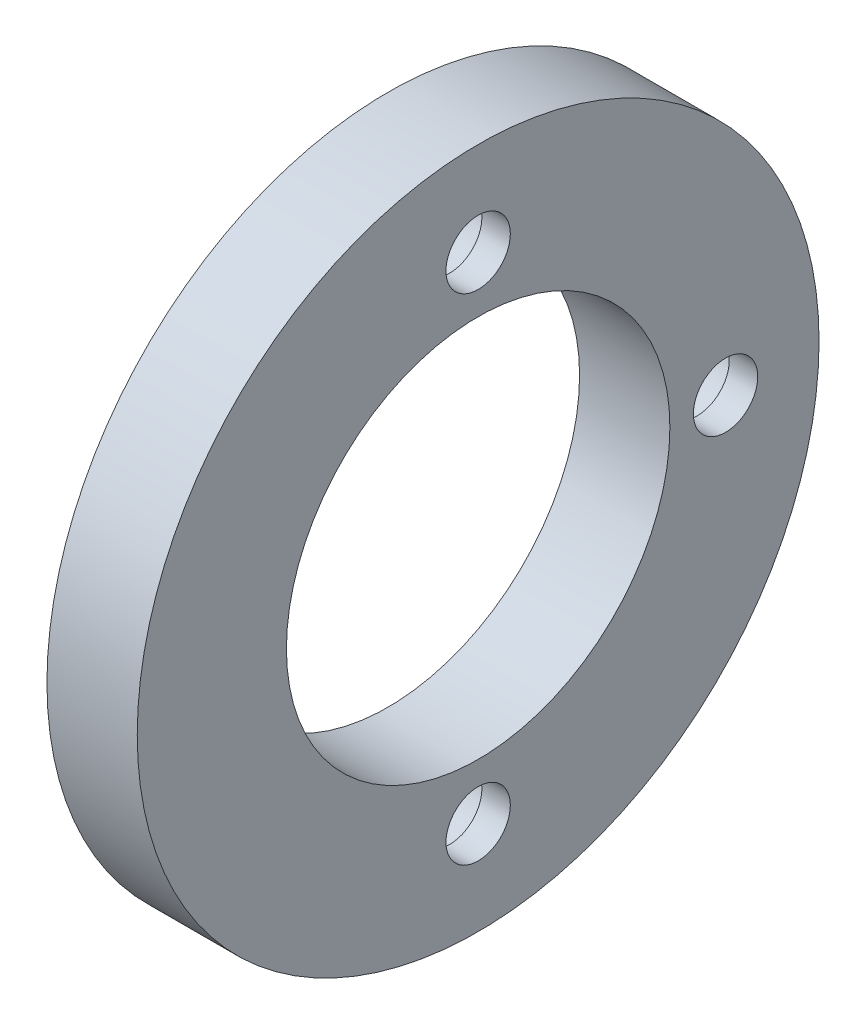
ISO-10303-21;
HEADER;
FILE_DESCRIPTION(('STEP AP214'),'2;1');
FILE_NAME('part.step','',(''),(''),'','','');
FILE_SCHEMA(('AUTOMOTIVE_DESIGN { 1 0 10303 214 1 1 1 1 }'));
ENDSEC;
DATA;
#1=APPLICATION_CONTEXT('core data for automotive mechanical design processes');
#2=APPLICATION_PROTOCOL_DEFINITION('international standard','automotive_design',2000,#1);
#3=PRODUCT_CONTEXT('',#1,'mechanical');
#4=PRODUCT('Part','Part','',(#3));
#5=PRODUCT_RELATED_PRODUCT_CATEGORY('part','',(#4));
#6=PRODUCT_DEFINITION_FORMATION('','',#4);
#7=PRODUCT_DEFINITION_CONTEXT('part definition',#1,'design');
#8=PRODUCT_DEFINITION('design','',#6,#7);
#9=PRODUCT_DEFINITION_SHAPE('','',#8);
#10=(LENGTH_UNIT() NAMED_UNIT(*) SI_UNIT(.MILLI.,.METRE.));
#11=(NAMED_UNIT(*) PLANE_ANGLE_UNIT() SI_UNIT($,.RADIAN.));
#12=(NAMED_UNIT(*) SI_UNIT($,.STERADIAN.) SOLID_ANGLE_UNIT());
#13=UNCERTAINTY_MEASURE_WITH_UNIT(LENGTH_MEASURE(1.E-05),#10,'distance_accuracy_value','');
#14=(GEOMETRIC_REPRESENTATION_CONTEXT(3) GLOBAL_UNCERTAINTY_ASSIGNED_CONTEXT((#13)) GLOBAL_UNIT_ASSIGNED_CONTEXT((#10,
#11,#12)) REPRESENTATION_CONTEXT('',''));
#15=CARTESIAN_POINT('',(0.,0.,0.));
#16=DIRECTION('',(0.,0.,1.));
#17=DIRECTION('',(1.,0.,0.));
#18=AXIS2_PLACEMENT_3D('',#15,#16,#17);
#19=CARTESIAN_POINT('',(9.271,0.,-25.4));
#20=DIRECTION('',(-1.,0.,0.));
#21=DIRECTION('',(0.,0.,1.));
#22=AXIS2_PLACEMENT_3D('',#19,#20,#21);
#23=CYLINDRICAL_SURFACE('',#22,3.302);
#24=CARTESIAN_POINT('',(9.271,0.,-25.4));
#25=DIRECTION('',(1.,0.,0.));
#26=DIRECTION('',(0.,0.,-1.));
#27=AXIS2_PLACEMENT_3D('',#24,#25,#26);
#28=CIRCLE('',#27,3.302);
#29=CARTESIAN_POINT('',(9.271,0.,-28.702));
#30=VERTEX_POINT('',#29);
#31=EDGE_CURVE('E77',#30,#30,#28,.T.);
#32=ORIENTED_EDGE('',*,*,#31,.T.);
#33=EDGE_LOOP('',(#32));
#34=FACE_BOUND('',#33,.T.);
#35=CARTESIAN_POINT('',(6.35,0.,-25.4));
#36=DIRECTION('',(-1.,0.,0.));
#37=DIRECTION('',(0.,0.,1.));
#38=AXIS2_PLACEMENT_3D('',#35,#36,#37);
#39=CIRCLE('',#38,3.302);
#40=CARTESIAN_POINT('',(6.35,0.,-22.098));
#41=VERTEX_POINT('',#40);
#42=EDGE_CURVE('E35',#41,#41,#39,.T.);
#43=ORIENTED_EDGE('',*,*,#42,.T.);
#44=EDGE_LOOP('',(#43));
#45=FACE_BOUND('',#44,.T.);
#46=ADVANCED_FACE('F31',(#34,#45),#23,.F.);
#47=CARTESIAN_POINT('',(9.271,-25.4,-7.15690213792593E-13));
#48=DIRECTION('',(-1.,0.,0.));
#49=DIRECTION('',(0.,0.,1.));
#50=AXIS2_PLACEMENT_3D('',#47,#48,#49);
#51=CYLINDRICAL_SURFACE('',#50,3.30200000000085);
#52=CARTESIAN_POINT('',(9.271,-25.4,-7.15690213792593E-13));
#53=DIRECTION('',(1.,0.,0.));
#54=DIRECTION('',(0.,0.,-1.));
#55=AXIS2_PLACEMENT_3D('',#52,#53,#54);
#56=CIRCLE('',#55,3.30200000000085);
#57=CARTESIAN_POINT('',(9.271,-25.4,-3.30200000000157));
#58=VERTEX_POINT('',#57);
#59=EDGE_CURVE('E52',#58,#58,#56,.T.);
#60=ORIENTED_EDGE('',*,*,#59,.T.);
#61=EDGE_LOOP('',(#60));
#62=FACE_BOUND('',#61,.T.);
#63=CARTESIAN_POINT('',(6.35,-25.4,-7.15690213792593E-13));
#64=DIRECTION('',(-1.,0.,0.));
#65=DIRECTION('',(0.,0.,1.));
#66=AXIS2_PLACEMENT_3D('',#63,#64,#65);
#67=CIRCLE('',#66,3.30200000000085);
#68=CARTESIAN_POINT('',(6.35,-25.4,3.30200000000014));
#69=VERTEX_POINT('',#68);
#70=EDGE_CURVE('E54',#69,#69,#67,.T.);
#71=ORIENTED_EDGE('',*,*,#70,.T.);
#72=EDGE_LOOP('',(#71));
#73=FACE_BOUND('',#72,.T.);
#74=ADVANCED_FACE('F106',(#62,#73),#51,.F.);
#75=CARTESIAN_POINT('',(9.271,25.4,0.));
#76=DIRECTION('',(-1.,0.,0.));
#77=DIRECTION('',(0.,0.,1.));
#78=AXIS2_PLACEMENT_3D('',#75,#76,#77);
#79=CYLINDRICAL_SURFACE('',#78,3.302);
#80=CARTESIAN_POINT('',(9.271,25.4,0.));
#81=DIRECTION('',(1.,0.,0.));
#82=DIRECTION('',(0.,0.,-1.));
#83=AXIS2_PLACEMENT_3D('',#80,#81,#82);
#84=CIRCLE('',#83,3.302);
#85=CARTESIAN_POINT('',(9.271,25.4,-3.302));
#86=VERTEX_POINT('',#85);
#87=EDGE_CURVE('E80',#86,#86,#84,.T.);
#88=ORIENTED_EDGE('',*,*,#87,.T.);
#89=EDGE_LOOP('',(#88));
#90=FACE_BOUND('',#89,.T.);
#91=CARTESIAN_POINT('',(6.35,25.4,0.));
#92=DIRECTION('',(-1.,0.,0.));
#93=DIRECTION('',(0.,0.,1.));
#94=AXIS2_PLACEMENT_3D('',#91,#92,#93);
#95=CIRCLE('',#94,3.302);
#96=CARTESIAN_POINT('',(6.35,25.4,3.302));
#97=VERTEX_POINT('',#96);
#98=EDGE_CURVE('E50',#97,#97,#95,.T.);
#99=ORIENTED_EDGE('',*,*,#98,.T.);
#100=EDGE_LOOP('',(#99));
#101=FACE_BOUND('',#100,.T.);
#102=ADVANCED_FACE('F112',(#90,#101),#79,.F.);
#103=CARTESIAN_POINT('',(9.271,0.,0.));
#104=DIRECTION('',(1.,0.,0.));
#105=DIRECTION('',(0.,0.,-1.));
#106=AXIS2_PLACEMENT_3D('',#103,#104,#105);
#107=PLANE('',#106);
#108=ORIENTED_EDGE('',*,*,#31,.F.);
#109=EDGE_LOOP('',(#108));
#110=FACE_BOUND('',#109,.T.);
#111=CARTESIAN_POINT('',(9.271,0.,0.));
#112=DIRECTION('',(1.,0.,0.));
#113=DIRECTION('',(0.,0.,-1.));
#114=AXIS2_PLACEMENT_3D('',#111,#112,#113);
#115=CIRCLE('',#114,19.685);
#116=CARTESIAN_POINT('',(9.271,0.,-19.685));
#117=VERTEX_POINT('',#116);
#118=EDGE_CURVE('E44',#117,#117,#115,.T.);
#119=ORIENTED_EDGE('',*,*,#118,.F.);
#120=EDGE_LOOP('',(#119));
#121=FACE_BOUND('',#120,.T.);
#122=CARTESIAN_POINT('',(9.271,0.,0.));
#123=DIRECTION('',(1.,0.,0.));
#124=DIRECTION('',(0.,0.,-1.));
#125=AXIS2_PLACEMENT_3D('',#122,#123,#124);
#126=CIRCLE('',#125,35.);
#127=CARTESIAN_POINT('',(9.271,0.,-35.));
#128=VERTEX_POINT('',#127);
#129=EDGE_CURVE('E10',#128,#128,#126,.T.);
#130=ORIENTED_EDGE('',*,*,#129,.T.);
#131=EDGE_LOOP('',(#130));
#132=FACE_BOUND('',#131,.T.);
#133=ORIENTED_EDGE('',*,*,#87,.F.);
#134=EDGE_LOOP('',(#133));
#135=FACE_BOUND('',#134,.T.);
#136=ORIENTED_EDGE('',*,*,#59,.F.);
#137=EDGE_LOOP('',(#136));
#138=FACE_BOUND('',#137,.T.);
#139=ADVANCED_FACE('F117',(#110,#121,#132,#135,#138),#107,.T.);
#140=CARTESIAN_POINT('',(0.,0.,0.));
#141=DIRECTION('',(1.,0.,0.));
#142=DIRECTION('',(0.,0.,-1.));
#143=AXIS2_PLACEMENT_3D('',#140,#141,#142);
#144=PLANE('',#143);
#145=CARTESIAN_POINT('',(0.,-3.54734504026462E-13,-25.3999999999996));
#146=DIRECTION('',(-1.,0.,0.));
#147=DIRECTION('',(0.,0.,1.));
#148=AXIS2_PLACEMENT_3D('',#145,#146,#147);
#149=CIRCLE('',#148,4.7625);
#150=CARTESIAN_POINT('',(0.,-3.54734504026462E-13,-20.6374999999996));
#151=VERTEX_POINT('',#150);
#152=EDGE_CURVE('E70',#151,#151,#149,.T.);
#153=ORIENTED_EDGE('',*,*,#152,.F.);
#154=EDGE_LOOP('',(#153));
#155=FACE_BOUND('',#154,.T.);
#156=CARTESIAN_POINT('',(0.,-25.4,7.15690213792593E-13));
#157=DIRECTION('',(-1.,0.,0.));
#158=DIRECTION('',(0.,0.,1.));
#159=AXIS2_PLACEMENT_3D('',#156,#157,#158);
#160=CIRCLE('',#159,4.7625);
#161=CARTESIAN_POINT('',(0.,-25.4,4.76250000000072));
#162=VERTEX_POINT('',#161);
#163=EDGE_CURVE('E63',#162,#162,#160,.T.);
#164=ORIENTED_EDGE('',*,*,#163,.F.);
#165=EDGE_LOOP('',(#164));
#166=FACE_BOUND('',#165,.T.);
#167=CARTESIAN_POINT('',(0.,25.4,0.));
#168=DIRECTION('',(-1.,0.,0.));
#169=DIRECTION('',(0.,0.,1.));
#170=AXIS2_PLACEMENT_3D('',#167,#168,#169);
#171=CIRCLE('',#170,4.7625);
#172=CARTESIAN_POINT('',(0.,25.4,4.7625));
#173=VERTEX_POINT('',#172);
#174=EDGE_CURVE('E56',#173,#173,#171,.T.);
#175=ORIENTED_EDGE('',*,*,#174,.F.);
#176=EDGE_LOOP('',(#175));
#177=FACE_BOUND('',#176,.T.);
#178=CARTESIAN_POINT('',(0.,0.,0.));
#179=DIRECTION('',(1.,0.,0.));
#180=DIRECTION('',(0.,0.,-1.));
#181=AXIS2_PLACEMENT_3D('',#178,#179,#180);
#182=CIRCLE('',#181,19.685);
#183=CARTESIAN_POINT('',(0.,0.,-19.685));
#184=VERTEX_POINT('',#183);
#185=EDGE_CURVE('E47',#184,#184,#182,.T.);
#186=ORIENTED_EDGE('',*,*,#185,.T.);
#187=EDGE_LOOP('',(#186));
#188=FACE_BOUND('',#187,.T.);
#189=CARTESIAN_POINT('',(0.,0.,0.));
#190=DIRECTION('',(1.,0.,0.));
#191=DIRECTION('',(0.,0.,-1.));
#192=AXIS2_PLACEMENT_3D('',#189,#190,#191);
#193=CIRCLE('',#192,35.);
#194=CARTESIAN_POINT('',(0.,0.,-35.));
#195=VERTEX_POINT('',#194);
#196=EDGE_CURVE('E39',#195,#195,#193,.T.);
#197=ORIENTED_EDGE('',*,*,#196,.F.);
#198=EDGE_LOOP('',(#197));
#199=FACE_BOUND('',#198,.T.);
#200=ADVANCED_FACE('F88',(#155,#166,#177,#188,#199),#144,.F.);
#201=CARTESIAN_POINT('',(9.271,0.,0.));
#202=DIRECTION('',(-1.,0.,0.));
#203=DIRECTION('',(0.,0.,1.));
#204=AXIS2_PLACEMENT_3D('',#201,#202,#203);
#205=CYLINDRICAL_SURFACE('',#204,35.);
#206=ORIENTED_EDGE('',*,*,#129,.F.);
#207=EDGE_LOOP('',(#206));
#208=FACE_BOUND('',#207,.T.);
#209=ORIENTED_EDGE('',*,*,#196,.T.);
#210=EDGE_LOOP('',(#209));
#211=FACE_BOUND('',#210,.T.);
#212=ADVANCED_FACE('F33',(#208,#211),#205,.T.);
#213=CARTESIAN_POINT('',(9.271,0.,0.));
#214=DIRECTION('',(-1.,0.,0.));
#215=DIRECTION('',(0.,0.,1.));
#216=AXIS2_PLACEMENT_3D('',#213,#214,#215);
#217=CYLINDRICAL_SURFACE('',#216,19.685);
#218=ORIENTED_EDGE('',*,*,#118,.T.);
#219=EDGE_LOOP('',(#218));
#220=FACE_BOUND('',#219,.T.);
#221=ORIENTED_EDGE('',*,*,#185,.F.);
#222=EDGE_LOOP('',(#221));
#223=FACE_BOUND('',#222,.T.);
#224=ADVANCED_FACE('F91',(#220,#223),#217,.F.);
#225=CARTESIAN_POINT('',(6.35,25.4,0.));
#226=DIRECTION('',(-1.,0.,0.));
#227=DIRECTION('',(0.,0.,1.));
#228=AXIS2_PLACEMENT_3D('',#225,#226,#227);
#229=CYLINDRICAL_SURFACE('',#228,4.7625);
#230=CARTESIAN_POINT('',(6.35,25.4,0.));
#231=DIRECTION('',(-1.,0.,0.));
#232=DIRECTION('',(0.,0.,1.));
#233=AXIS2_PLACEMENT_3D('',#230,#231,#232);
#234=CIRCLE('',#233,4.7625);
#235=CARTESIAN_POINT('',(6.35,25.4,4.7625));
#236=VERTEX_POINT('',#235);
#237=EDGE_CURVE('E53',#236,#236,#234,.T.);
#238=ORIENTED_EDGE('',*,*,#237,.F.);
#239=EDGE_LOOP('',(#238));
#240=FACE_BOUND('',#239,.T.);
#241=ORIENTED_EDGE('',*,*,#174,.T.);
#242=EDGE_LOOP('',(#241));
#243=FACE_BOUND('',#242,.T.);
#244=ADVANCED_FACE('F93',(#240,#243),#229,.F.);
#245=CARTESIAN_POINT('',(6.35,25.4,0.));
#246=DIRECTION('',(-1.,0.,0.));
#247=DIRECTION('',(0.,0.,1.));
#248=AXIS2_PLACEMENT_3D('',#245,#246,#247);
#249=PLANE('',#248);
#250=ORIENTED_EDGE('',*,*,#98,.F.);
#251=EDGE_LOOP('',(#250));
#252=FACE_BOUND('',#251,.T.);
#253=ORIENTED_EDGE('',*,*,#237,.T.);
#254=EDGE_LOOP('',(#253));
#255=FACE_BOUND('',#254,.T.);
#256=ADVANCED_FACE('F99',(#252,#255),#249,.T.);
#257=CARTESIAN_POINT('',(6.35,-25.4,7.15690213792593E-13));
#258=DIRECTION('',(-1.,0.,0.));
#259=DIRECTION('',(0.,0.,1.));
#260=AXIS2_PLACEMENT_3D('',#257,#258,#259);
#261=CYLINDRICAL_SURFACE('',#260,4.7625);
#262=CARTESIAN_POINT('',(6.35,-25.4,7.15690213792593E-13));
#263=DIRECTION('',(-1.,0.,0.));
#264=DIRECTION('',(0.,0.,1.));
#265=AXIS2_PLACEMENT_3D('',#262,#263,#264);
#266=CIRCLE('',#265,4.7625);
#267=CARTESIAN_POINT('',(6.35,-25.4,4.76250000000072));
#268=VERTEX_POINT('',#267);
#269=EDGE_CURVE('E57',#268,#268,#266,.T.);
#270=ORIENTED_EDGE('',*,*,#269,.F.);
#271=EDGE_LOOP('',(#270));
#272=FACE_BOUND('',#271,.T.);
#273=ORIENTED_EDGE('',*,*,#163,.T.);
#274=EDGE_LOOP('',(#273));
#275=FACE_BOUND('',#274,.T.);
#276=ADVANCED_FACE('F129',(#272,#275),#261,.F.);
#277=CARTESIAN_POINT('',(6.35,-25.4,7.15690213792593E-13));
#278=DIRECTION('',(-1.,0.,0.));
#279=DIRECTION('',(0.,0.,1.));
#280=AXIS2_PLACEMENT_3D('',#277,#278,#279);
#281=PLANE('',#280);
#282=ORIENTED_EDGE('',*,*,#70,.F.);
#283=EDGE_LOOP('',(#282));
#284=FACE_BOUND('',#283,.T.);
#285=ORIENTED_EDGE('',*,*,#269,.T.);
#286=EDGE_LOOP('',(#285));
#287=FACE_BOUND('',#286,.T.);
#288=ADVANCED_FACE('F145',(#284,#287),#281,.T.);
#289=CARTESIAN_POINT('',(6.35,-3.54734504026462E-13,-25.3999999999996));
#290=DIRECTION('',(-1.,0.,0.));
#291=DIRECTION('',(0.,0.,1.));
#292=AXIS2_PLACEMENT_3D('',#289,#290,#291);
#293=CYLINDRICAL_SURFACE('',#292,4.7625);
#294=CARTESIAN_POINT('',(6.35,-3.54734504026462E-13,-25.3999999999996));
#295=DIRECTION('',(-1.,0.,0.));
#296=DIRECTION('',(0.,0.,1.));
#297=AXIS2_PLACEMENT_3D('',#294,#295,#296);
#298=CIRCLE('',#297,4.7625);
#299=CARTESIAN_POINT('',(6.35,-3.54734504026462E-13,-20.6374999999996));
#300=VERTEX_POINT('',#299);
#301=EDGE_CURVE('E168',#300,#300,#298,.T.);
#302=ORIENTED_EDGE('',*,*,#301,.F.);
#303=EDGE_LOOP('',(#302));
#304=FACE_BOUND('',#303,.T.);
#305=ORIENTED_EDGE('',*,*,#152,.T.);
#306=EDGE_LOOP('',(#305));
#307=FACE_BOUND('',#306,.T.);
#308=ADVANCED_FACE('F151',(#304,#307),#293,.F.);
#309=CARTESIAN_POINT('',(6.35,-3.54734504026462E-13,-25.3999999999996));
#310=DIRECTION('',(-1.,0.,0.));
#311=DIRECTION('',(0.,0.,1.));
#312=AXIS2_PLACEMENT_3D('',#309,#310,#311);
#313=PLANE('',#312);
#314=ORIENTED_EDGE('',*,*,#42,.F.);
#315=EDGE_LOOP('',(#314));
#316=FACE_BOUND('',#315,.T.);
#317=ORIENTED_EDGE('',*,*,#301,.T.);
#318=EDGE_LOOP('',(#317));
#319=FACE_BOUND('',#318,.T.);
#320=ADVANCED_FACE('F157',(#316,#319),#313,.T.);
#321=CLOSED_SHELL('',(#46,#74,#102,#139,#200,#212,#224,#244,#256,#276,#288,#308,#320));
#322=MANIFOLD_SOLID_BREP('B2',#321);
#323=ADVANCED_BREP_SHAPE_REPRESENTATION('',(#18,#322),#14);
#324=SHAPE_DEFINITION_REPRESENTATION(#9,#323);
ENDSEC;
END-ISO-10303-21;
